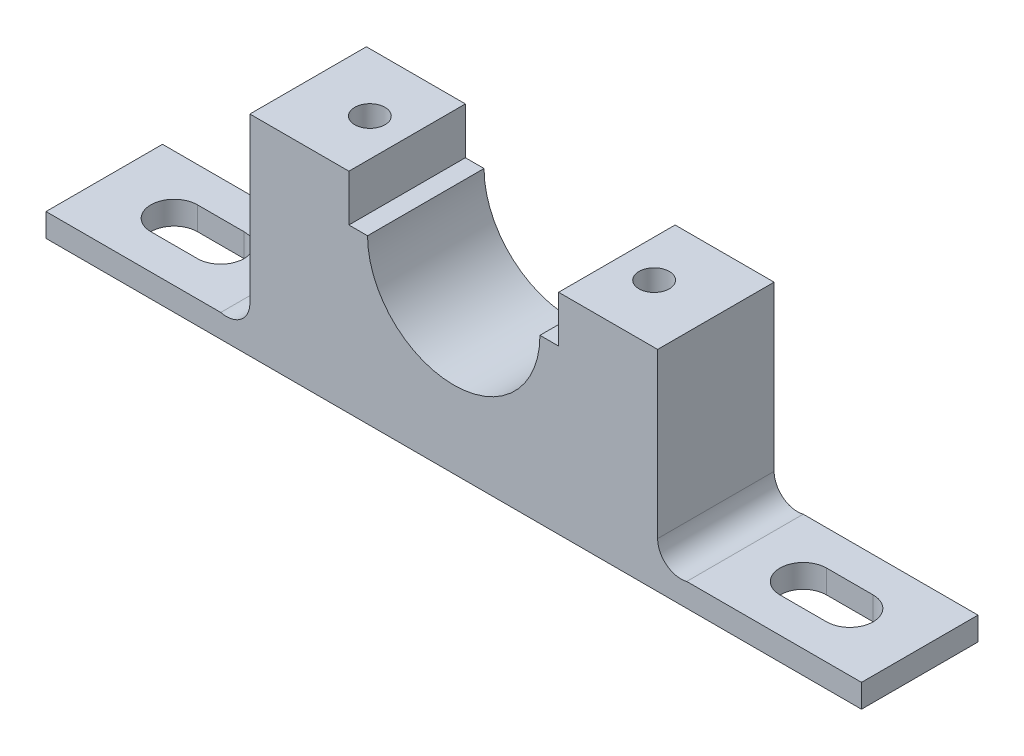
ISO-10303-21;
HEADER;
FILE_DESCRIPTION(('STEP AP214'),'2;1');
FILE_NAME('part.step','',(''),(''),'','','');
FILE_SCHEMA(('AUTOMOTIVE_DESIGN { 1 0 10303 214 1 1 1 1 }'));
ENDSEC;
DATA;
#1=APPLICATION_CONTEXT('core data for automotive mechanical design processes');
#2=APPLICATION_PROTOCOL_DEFINITION('international standard','automotive_design',2000,#1);
#3=PRODUCT_CONTEXT('',#1,'mechanical');
#4=PRODUCT('Part','Part','',(#3));
#5=PRODUCT_RELATED_PRODUCT_CATEGORY('part','',(#4));
#6=PRODUCT_DEFINITION_FORMATION('','',#4);
#7=PRODUCT_DEFINITION_CONTEXT('part definition',#1,'design');
#8=PRODUCT_DEFINITION('design','',#6,#7);
#9=PRODUCT_DEFINITION_SHAPE('','',#8);
#10=(LENGTH_UNIT() NAMED_UNIT(*) SI_UNIT(.MILLI.,.METRE.));
#11=(NAMED_UNIT(*) PLANE_ANGLE_UNIT() SI_UNIT($,.RADIAN.));
#12=(NAMED_UNIT(*) SI_UNIT($,.STERADIAN.) SOLID_ANGLE_UNIT());
#13=UNCERTAINTY_MEASURE_WITH_UNIT(LENGTH_MEASURE(1.E-05),#10,'distance_accuracy_value','');
#14=(GEOMETRIC_REPRESENTATION_CONTEXT(3) GLOBAL_UNCERTAINTY_ASSIGNED_CONTEXT((#13)) GLOBAL_UNIT_ASSIGNED_CONTEXT((#10,
#11,#12)) REPRESENTATION_CONTEXT('',''));
#15=CARTESIAN_POINT('',(0.,0.,0.));
#16=DIRECTION('',(0.,0.,1.));
#17=DIRECTION('',(1.,0.,0.));
#18=AXIS2_PLACEMENT_3D('',#15,#16,#17);
#19=CARTESIAN_POINT('',(87.5,0.,-12.5));
#20=DIRECTION('',(0.,1.,0.));
#21=DIRECTION('',(0.,0.,1.));
#22=AXIS2_PLACEMENT_3D('',#19,#20,#21);
#23=PLANE('',#22);
#24=DIRECTION('',(-1.,0.,0.));
#25=VECTOR('',#24,1.);
#26=CARTESIAN_POINT('',(72.5026506643701,0.,5.00000000000003));
#27=LINE('',#26,#25);
#28=CARTESIAN_POINT('',(72.5026506643701,0.,5.00000000000003));
#29=VERTEX_POINT('',#28);
#30=CARTESIAN_POINT('',(62.5026506643701,0.,5.00000000000003));
#31=VERTEX_POINT('',#30);
#32=EDGE_CURVE('E256',#29,#31,#27,.T.);
#33=ORIENTED_EDGE('',*,*,#32,.F.);
#34=CARTESIAN_POINT('',(72.5026506643701,0.,0.));
#35=DIRECTION('',(0.,-1.,0.));
#36=DIRECTION('',(0.,0.,-1.));
#37=AXIS2_PLACEMENT_3D('',#34,#35,#36);
#38=CIRCLE('',#37,5.);
#39=CARTESIAN_POINT('',(72.5026506643701,0.,-4.99999999999997));
#40=VERTEX_POINT('',#39);
#41=EDGE_CURVE('E63',#40,#29,#38,.T.);
#42=ORIENTED_EDGE('',*,*,#41,.F.);
#43=DIRECTION('',(-1.,0.,0.));
#44=VECTOR('',#43,1.);
#45=CARTESIAN_POINT('',(72.5026506643701,0.,-4.99999999999997));
#46=LINE('',#45,#44);
#47=CARTESIAN_POINT('',(62.5026506643701,0.,-4.99999999999997));
#48=VERTEX_POINT('',#47);
#49=EDGE_CURVE('E240',#40,#48,#46,.T.);
#50=ORIENTED_EDGE('',*,*,#49,.T.);
#51=CARTESIAN_POINT('',(62.5026506643701,0.,0.));
#52=DIRECTION('',(0.,1.,0.));
#53=DIRECTION('',(0.,0.,1.));
#54=AXIS2_PLACEMENT_3D('',#51,#52,#53);
#55=CIRCLE('',#54,5.);
#56=EDGE_CURVE('E252',#48,#31,#55,.T.);
#57=ORIENTED_EDGE('',*,*,#56,.T.);
#58=EDGE_LOOP('',(#33,#42,#50,#57));
#59=FACE_BOUND('',#58,.T.);
#60=CARTESIAN_POINT('',(-30.5,0.,0.));
#61=DIRECTION('',(0.,1.,0.));
#62=DIRECTION('',(0.,0.,1.));
#63=AXIS2_PLACEMENT_3D('',#60,#61,#62);
#64=CIRCLE('',#63,3.25);
#65=CARTESIAN_POINT('',(-30.5,0.,-3.24999999999998));
#66=VERTEX_POINT('',#65);
#67=EDGE_CURVE('E271',#66,#66,#64,.T.);
#68=ORIENTED_EDGE('',*,*,#67,.T.);
#69=EDGE_LOOP('',(#68));
#70=FACE_BOUND('',#69,.T.);
#71=DIRECTION('',(0.,0.,1.));
#72=VECTOR('',#71,1.);
#73=CARTESIAN_POINT('',(87.5,0.,-12.5));
#74=LINE('',#73,#72);
#75=CARTESIAN_POINT('',(87.5,0.,-12.5));
#76=VERTEX_POINT('',#75);
#77=CARTESIAN_POINT('',(87.5,0.,12.5));
#78=VERTEX_POINT('',#77);
#79=EDGE_CURVE('E426',#76,#78,#74,.T.);
#80=ORIENTED_EDGE('',*,*,#79,.T.);
#81=DIRECTION('',(-1.,0.,0.));
#82=VECTOR('',#81,1.);
#83=CARTESIAN_POINT('',(87.5,0.,12.5));
#84=LINE('',#83,#82);
#85=CARTESIAN_POINT('',(-87.5,0.,12.5));
#86=VERTEX_POINT('',#85);
#87=EDGE_CURVE('E321',#78,#86,#84,.T.);
#88=ORIENTED_EDGE('',*,*,#87,.T.);
#89=DIRECTION('',(0.,0.,1.));
#90=VECTOR('',#89,1.);
#91=CARTESIAN_POINT('',(-87.5,0.,-12.5));
#92=LINE('',#91,#90);
#93=CARTESIAN_POINT('',(-87.5,0.,-12.5));
#94=VERTEX_POINT('',#93);
#95=EDGE_CURVE('E423',#94,#86,#92,.T.);
#96=ORIENTED_EDGE('',*,*,#95,.F.);
#97=DIRECTION('',(-1.,0.,0.));
#98=VECTOR('',#97,1.);
#99=CARTESIAN_POINT('',(87.5,0.,-12.5));
#100=LINE('',#99,#98);
#101=EDGE_CURVE('E381',#76,#94,#100,.T.);
#102=ORIENTED_EDGE('',*,*,#101,.F.);
#103=EDGE_LOOP('',(#80,#88,#96,#102));
#104=FACE_BOUND('',#103,.T.);
#105=CARTESIAN_POINT('',(30.5,0.,0.));
#106=DIRECTION('',(0.,-1.,0.));
#107=DIRECTION('',(0.,0.,-1.));
#108=AXIS2_PLACEMENT_3D('',#105,#106,#107);
#109=CIRCLE('',#108,3.25);
#110=CARTESIAN_POINT('',(30.5,0.,-3.24999999999998));
#111=VERTEX_POINT('',#110);
#112=EDGE_CURVE('E267',#111,#111,#109,.T.);
#113=ORIENTED_EDGE('',*,*,#112,.F.);
#114=EDGE_LOOP('',(#113));
#115=FACE_BOUND('',#114,.T.);
#116=CARTESIAN_POINT('',(-72.5026506643701,0.,0.));
#117=DIRECTION('',(0.,1.,0.));
#118=DIRECTION('',(0.,0.,1.));
#119=AXIS2_PLACEMENT_3D('',#116,#117,#118);
#120=CIRCLE('',#119,5.);
#121=CARTESIAN_POINT('',(-72.5026506643701,0.,-4.99999999999997));
#122=VERTEX_POINT('',#121);
#123=CARTESIAN_POINT('',(-72.5026506643701,0.,5.00000000000003));
#124=VERTEX_POINT('',#123);
#125=EDGE_CURVE('E230',#122,#124,#120,.T.);
#126=ORIENTED_EDGE('',*,*,#125,.T.);
#127=DIRECTION('',(1.,0.,0.));
#128=VECTOR('',#127,1.);
#129=CARTESIAN_POINT('',(-72.5026506643701,0.,5.00000000000003));
#130=LINE('',#129,#128);
#131=CARTESIAN_POINT('',(-62.5026506643701,0.,5.00000000000003));
#132=VERTEX_POINT('',#131);
#133=EDGE_CURVE('E226',#124,#132,#130,.T.);
#134=ORIENTED_EDGE('',*,*,#133,.T.);
#135=CARTESIAN_POINT('',(-62.5026506643701,0.,0.));
#136=DIRECTION('',(0.,-1.,0.));
#137=DIRECTION('',(0.,0.,-1.));
#138=AXIS2_PLACEMENT_3D('',#135,#136,#137);
#139=CIRCLE('',#138,5.);
#140=CARTESIAN_POINT('',(-62.5026506643701,0.,-4.99999999999997));
#141=VERTEX_POINT('',#140);
#142=EDGE_CURVE('E206',#141,#132,#139,.T.);
#143=ORIENTED_EDGE('',*,*,#142,.F.);
#144=DIRECTION('',(1.,0.,0.));
#145=VECTOR('',#144,1.);
#146=CARTESIAN_POINT('',(-72.5026506643701,0.,-4.99999999999997));
#147=LINE('',#146,#145);
#148=EDGE_CURVE('E218',#122,#141,#147,.T.);
#149=ORIENTED_EDGE('',*,*,#148,.F.);
#150=EDGE_LOOP('',(#126,#134,#143,#149));
#151=FACE_BOUND('',#150,.T.);
#152=ADVANCED_FACE('F39',(#59,#70,#104,#115,#151),#23,.F.);
#153=CARTESIAN_POINT('',(-87.5,4.99999999999999,-12.5));
#154=DIRECTION('',(0.,-1.,0.));
#155=DIRECTION('',(0.,0.,-1.));
#156=AXIS2_PLACEMENT_3D('',#153,#154,#155);
#157=PLANE('',#156);
#158=DIRECTION('',(0.,0.,1.));
#159=VECTOR('',#158,1.);
#160=CARTESIAN_POINT('',(-87.5,4.99999999999999,-12.5));
#161=LINE('',#160,#159);
#162=CARTESIAN_POINT('',(-87.5,4.99999999999999,-12.5));
#163=VERTEX_POINT('',#162);
#164=CARTESIAN_POINT('',(-87.5,4.99999999999999,12.5));
#165=VERTEX_POINT('',#164);
#166=EDGE_CURVE('E420',#163,#165,#161,.T.);
#167=ORIENTED_EDGE('',*,*,#166,.T.);
#168=DIRECTION('',(1.,0.,0.));
#169=VECTOR('',#168,1.);
#170=CARTESIAN_POINT('',(-87.5,4.99999999999999,12.5));
#171=LINE('',#170,#169);
#172=CARTESIAN_POINT('',(-49.9965747482538,4.99999999999999,12.5));
#173=VERTEX_POINT('',#172);
#174=EDGE_CURVE('E329',#165,#173,#171,.T.);
#175=ORIENTED_EDGE('',*,*,#174,.T.);
#176=DIRECTION('',(0.,0.,1.));
#177=VECTOR('',#176,1.);
#178=CARTESIAN_POINT('',(-49.9965747482538,4.99999999999999,-12.5));
#179=LINE('',#178,#177);
#180=CARTESIAN_POINT('',(-49.9965747482538,4.99999999999999,-12.5));
#181=VERTEX_POINT('',#180);
#182=EDGE_CURVE('E417',#181,#173,#179,.T.);
#183=ORIENTED_EDGE('',*,*,#182,.F.);
#184=DIRECTION('',(1.,0.,0.));
#185=VECTOR('',#184,1.);
#186=CARTESIAN_POINT('',(-87.5,4.99999999999999,-12.5));
#187=LINE('',#186,#185);
#188=EDGE_CURVE('E387',#163,#181,#187,.T.);
#189=ORIENTED_EDGE('',*,*,#188,.F.);
#190=EDGE_LOOP('',(#167,#175,#183,#189));
#191=FACE_BOUND('',#190,.T.);
#192=CARTESIAN_POINT('',(-72.5026506643701,5.,0.));
#193=DIRECTION('',(0.,-1.,0.));
#194=DIRECTION('',(0.,0.,-1.));
#195=AXIS2_PLACEMENT_3D('',#192,#193,#194);
#196=CIRCLE('',#195,5.);
#197=CARTESIAN_POINT('',(-72.5026506643701,5.,-4.99999999999997));
#198=VERTEX_POINT('',#197);
#199=CARTESIAN_POINT('',(-72.5026506643701,5.,5.00000000000003));
#200=VERTEX_POINT('',#199);
#201=EDGE_CURVE('E11',#198,#200,#196,.F.);
#202=ORIENTED_EDGE('',*,*,#201,.F.);
#203=DIRECTION('',(1.,0.,0.));
#204=VECTOR('',#203,1.);
#205=CARTESIAN_POINT('',(-87.5,4.99999999999999,-4.99999999999997));
#206=LINE('',#205,#204);
#207=CARTESIAN_POINT('',(-62.5026506643701,4.99999999999999,-4.99999999999997));
#208=VERTEX_POINT('',#207);
#209=EDGE_CURVE('E453',#198,#208,#206,.T.);
#210=ORIENTED_EDGE('',*,*,#209,.T.);
#211=CARTESIAN_POINT('',(-62.5026506643701,5.,0.));
#212=DIRECTION('',(0.,-1.,0.));
#213=DIRECTION('',(0.,0.,-1.));
#214=AXIS2_PLACEMENT_3D('',#211,#212,#213);
#215=CIRCLE('',#214,5.);
#216=CARTESIAN_POINT('',(-62.5026506643701,5.00000000000001,5.00000000000003));
#217=VERTEX_POINT('',#216);
#218=EDGE_CURVE('E209',#208,#217,#215,.T.);
#219=ORIENTED_EDGE('',*,*,#218,.T.);
#220=DIRECTION('',(1.,0.,0.));
#221=VECTOR('',#220,1.);
#222=CARTESIAN_POINT('',(-87.5,4.99999999999999,5.00000000000002));
#223=LINE('',#222,#221);
#224=EDGE_CURVE('E48',#200,#217,#223,.T.);
#225=ORIENTED_EDGE('',*,*,#224,.F.);
#226=EDGE_LOOP('',(#202,#210,#219,#225));
#227=FACE_BOUND('',#226,.T.);
#228=ADVANCED_FACE('F466',(#191,#227),#157,.F.);
#229=CARTESIAN_POINT('',(-22.5,35.,-12.5));
#230=DIRECTION('',(0.,-1.,0.));
#231=DIRECTION('',(0.,0.,-1.));
#232=AXIS2_PLACEMENT_3D('',#229,#230,#231);
#233=PLANE('',#232);
#234=DIRECTION('',(0.,0.,1.));
#235=VECTOR('',#234,1.);
#236=CARTESIAN_POINT('',(-22.5,35.,-12.5));
#237=LINE('',#236,#235);
#238=CARTESIAN_POINT('',(-22.5,35.,-12.5));
#239=VERTEX_POINT('',#238);
#240=CARTESIAN_POINT('',(-22.5,35.,12.5));
#241=VERTEX_POINT('',#240);
#242=EDGE_CURVE('E405',#239,#241,#237,.T.);
#243=ORIENTED_EDGE('',*,*,#242,.T.);
#244=DIRECTION('',(1.,0.,0.));
#245=VECTOR('',#244,1.);
#246=CARTESIAN_POINT('',(-22.5,35.,12.5));
#247=LINE('',#246,#245);
#248=CARTESIAN_POINT('',(-18.5,35.,12.5));
#249=VERTEX_POINT('',#248);
#250=EDGE_CURVE('E285',#241,#249,#247,.T.);
#251=ORIENTED_EDGE('',*,*,#250,.T.);
#252=DIRECTION('',(0.,0.,1.));
#253=VECTOR('',#252,1.);
#254=CARTESIAN_POINT('',(-18.5,35.,-12.5));
#255=LINE('',#254,#253);
#256=CARTESIAN_POINT('',(-18.5,35.,-12.5));
#257=VERTEX_POINT('',#256);
#258=EDGE_CURVE('E450',#257,#249,#255,.T.);
#259=ORIENTED_EDGE('',*,*,#258,.F.);
#260=DIRECTION('',(1.,0.,0.));
#261=VECTOR('',#260,1.);
#262=CARTESIAN_POINT('',(-22.5,35.,-12.5));
#263=LINE('',#262,#261);
#264=EDGE_CURVE('E349',#239,#257,#263,.T.);
#265=ORIENTED_EDGE('',*,*,#264,.F.);
#266=EDGE_LOOP('',(#243,#251,#259,#265));
#267=FACE_BOUND('',#266,.T.);
#268=ADVANCED_FACE('F41',(#267),#233,.F.);
#269=CARTESIAN_POINT('',(0.,35.,-12.5));
#270=DIRECTION('',(0.,0.,1.));
#271=DIRECTION('',(1.,0.,0.));
#272=AXIS2_PLACEMENT_3D('',#269,#270,#271);
#273=CYLINDRICAL_SURFACE('',#272,18.5);
#274=ORIENTED_EDGE('',*,*,#258,.T.);
#275=CARTESIAN_POINT('',(0.,35.,12.5));
#276=DIRECTION('',(0.,0.,1.));
#277=DIRECTION('',(1.,0.,0.));
#278=AXIS2_PLACEMENT_3D('',#275,#276,#277);
#279=CIRCLE('',#278,18.5);
#280=CARTESIAN_POINT('',(18.5,35.,12.5));
#281=VERTEX_POINT('',#280);
#282=EDGE_CURVE('E289',#249,#281,#279,.T.);
#283=ORIENTED_EDGE('',*,*,#282,.T.);
#284=DIRECTION('',(0.,0.,1.));
#285=VECTOR('',#284,1.);
#286=CARTESIAN_POINT('',(18.5,35.,-12.5));
#287=LINE('',#286,#285);
#288=CARTESIAN_POINT('',(18.5,35.,-12.5));
#289=VERTEX_POINT('',#288);
#290=EDGE_CURVE('E447',#289,#281,#287,.T.);
#291=ORIENTED_EDGE('',*,*,#290,.F.);
#292=CARTESIAN_POINT('',(0.,35.,-12.5));
#293=DIRECTION('',(0.,0.,1.));
#294=DIRECTION('',(1.,0.,0.));
#295=AXIS2_PLACEMENT_3D('',#292,#293,#294);
#296=CIRCLE('',#295,18.5);
#297=EDGE_CURVE('E353',#257,#289,#296,.T.);
#298=ORIENTED_EDGE('',*,*,#297,.F.);
#299=EDGE_LOOP('',(#274,#283,#291,#298));
#300=FACE_BOUND('',#299,.T.);
#301=ADVANCED_FACE('F533',(#300),#273,.F.);
#302=CARTESIAN_POINT('',(22.5,35.,-12.5));
#303=DIRECTION('',(0.,1.,0.));
#304=DIRECTION('',(0.,0.,1.));
#305=AXIS2_PLACEMENT_3D('',#302,#303,#304);
#306=PLANE('',#305);
#307=ORIENTED_EDGE('',*,*,#290,.T.);
#308=DIRECTION('',(-1.,0.,0.));
#309=VECTOR('',#308,1.);
#310=CARTESIAN_POINT('',(22.5,35.,12.5));
#311=LINE('',#310,#309);
#312=CARTESIAN_POINT('',(22.5,35.,12.5));
#313=VERTEX_POINT('',#312);
#314=EDGE_CURVE('E293',#313,#281,#311,.T.);
#315=ORIENTED_EDGE('',*,*,#314,.F.);
#316=DIRECTION('',(0.,0.,1.));
#317=VECTOR('',#316,1.);
#318=CARTESIAN_POINT('',(22.5,35.,-12.5));
#319=LINE('',#318,#317);
#320=CARTESIAN_POINT('',(22.5,35.,-12.5));
#321=VERTEX_POINT('',#320);
#322=EDGE_CURVE('E444',#321,#313,#319,.T.);
#323=ORIENTED_EDGE('',*,*,#322,.F.);
#324=DIRECTION('',(-1.,0.,0.));
#325=VECTOR('',#324,1.);
#326=CARTESIAN_POINT('',(22.5,35.,-12.5));
#327=LINE('',#326,#325);
#328=EDGE_CURVE('E356',#321,#289,#327,.T.);
#329=ORIENTED_EDGE('',*,*,#328,.T.);
#330=EDGE_LOOP('',(#307,#315,#323,#329));
#331=FACE_BOUND('',#330,.T.);
#332=ADVANCED_FACE('F530',(#331),#306,.T.);
#333=CARTESIAN_POINT('',(22.5,45.,-12.5));
#334=DIRECTION('',(-1.,0.,0.));
#335=DIRECTION('',(0.,-1.,0.));
#336=AXIS2_PLACEMENT_3D('',#333,#334,#335);
#337=PLANE('',#336);
#338=ORIENTED_EDGE('',*,*,#322,.T.);
#339=DIRECTION('',(0.,-1.,0.));
#340=VECTOR('',#339,1.);
#341=CARTESIAN_POINT('',(22.5,45.,12.5));
#342=LINE('',#341,#340);
#343=CARTESIAN_POINT('',(22.5,45.,12.5));
#344=VERTEX_POINT('',#343);
#345=EDGE_CURVE('E297',#344,#313,#342,.T.);
#346=ORIENTED_EDGE('',*,*,#345,.F.);
#347=DIRECTION('',(0.,0.,1.));
#348=VECTOR('',#347,1.);
#349=CARTESIAN_POINT('',(22.5,45.,-12.5));
#350=LINE('',#349,#348);
#351=CARTESIAN_POINT('',(22.5,45.,-12.5));
#352=VERTEX_POINT('',#351);
#353=EDGE_CURVE('E441',#352,#344,#350,.T.);
#354=ORIENTED_EDGE('',*,*,#353,.F.);
#355=DIRECTION('',(0.,-1.,0.));
#356=VECTOR('',#355,1.);
#357=CARTESIAN_POINT('',(22.5,45.,-12.5));
#358=LINE('',#357,#356);
#359=EDGE_CURVE('E360',#352,#321,#358,.T.);
#360=ORIENTED_EDGE('',*,*,#359,.T.);
#361=EDGE_LOOP('',(#338,#346,#354,#360));
#362=FACE_BOUND('',#361,.T.);
#363=ADVANCED_FACE('F526',(#362),#337,.T.);
#364=CARTESIAN_POINT('',(22.5,45.,-12.5));
#365=DIRECTION('',(0.,-1.,0.));
#366=DIRECTION('',(0.,0.,-1.));
#367=AXIS2_PLACEMENT_3D('',#364,#365,#366);
#368=PLANE('',#367);
#369=CARTESIAN_POINT('',(30.5,45.,0.));
#370=DIRECTION('',(0.,-1.,0.));
#371=DIRECTION('',(0.,0.,-1.));
#372=AXIS2_PLACEMENT_3D('',#369,#370,#371);
#373=CIRCLE('',#372,3.25);
#374=CARTESIAN_POINT('',(30.5,45.,-3.24999999999998));
#375=VERTEX_POINT('',#374);
#376=EDGE_CURVE('E262',#375,#375,#373,.T.);
#377=ORIENTED_EDGE('',*,*,#376,.T.);
#378=EDGE_LOOP('',(#377));
#379=FACE_BOUND('',#378,.T.);
#380=ORIENTED_EDGE('',*,*,#353,.T.);
#381=DIRECTION('',(1.,0.,0.));
#382=VECTOR('',#381,1.);
#383=CARTESIAN_POINT('',(22.5,45.,12.5));
#384=LINE('',#383,#382);
#385=CARTESIAN_POINT('',(43.75,45.,12.5));
#386=VERTEX_POINT('',#385);
#387=EDGE_CURVE('E301',#344,#386,#384,.T.);
#388=ORIENTED_EDGE('',*,*,#387,.T.);
#389=DIRECTION('',(0.,0.,1.));
#390=VECTOR('',#389,1.);
#391=CARTESIAN_POINT('',(43.75,45.,-12.5));
#392=LINE('',#391,#390);
#393=CARTESIAN_POINT('',(43.75,45.,-12.5));
#394=VERTEX_POINT('',#393);
#395=EDGE_CURVE('E438',#394,#386,#392,.T.);
#396=ORIENTED_EDGE('',*,*,#395,.F.);
#397=DIRECTION('',(1.,0.,0.));
#398=VECTOR('',#397,1.);
#399=CARTESIAN_POINT('',(22.5,45.,-12.5));
#400=LINE('',#399,#398);
#401=EDGE_CURVE('E364',#352,#394,#400,.T.);
#402=ORIENTED_EDGE('',*,*,#401,.F.);
#403=EDGE_LOOP('',(#380,#388,#396,#402));
#404=FACE_BOUND('',#403,.T.);
#405=ADVANCED_FACE('F522',(#379,#404),#368,.F.);
#406=CARTESIAN_POINT('',(43.75,45.,-12.5));
#407=DIRECTION('',(-1.,0.,0.));
#408=DIRECTION('',(0.,-1.,0.));
#409=AXIS2_PLACEMENT_3D('',#406,#407,#408);
#410=PLANE('',#409);
#411=ORIENTED_EDGE('',*,*,#395,.T.);
#412=DIRECTION('',(0.,-1.,0.));
#413=VECTOR('',#412,1.);
#414=CARTESIAN_POINT('',(43.75,45.,12.5));
#415=LINE('',#414,#413);
#416=CARTESIAN_POINT('',(43.75,9.84211228670047,12.5));
#417=VERTEX_POINT('',#416);
#418=EDGE_CURVE('E305',#386,#417,#415,.T.);
#419=ORIENTED_EDGE('',*,*,#418,.T.);
#420=DIRECTION('',(0.,0.,1.));
#421=VECTOR('',#420,1.);
#422=CARTESIAN_POINT('',(43.75,9.84211228670047,-12.5));
#423=LINE('',#422,#421);
#424=CARTESIAN_POINT('',(43.75,9.84211228670047,-12.5));
#425=VERTEX_POINT('',#424);
#426=EDGE_CURVE('E435',#425,#417,#423,.T.);
#427=ORIENTED_EDGE('',*,*,#426,.F.);
#428=DIRECTION('',(0.,-1.,0.));
#429=VECTOR('',#428,1.);
#430=CARTESIAN_POINT('',(43.75,45.,-12.5));
#431=LINE('',#430,#429);
#432=EDGE_CURVE('E367',#394,#425,#431,.T.);
#433=ORIENTED_EDGE('',*,*,#432,.F.);
#434=EDGE_LOOP('',(#411,#419,#427,#433));
#435=FACE_BOUND('',#434,.T.);
#436=ADVANCED_FACE('F518',(#435),#410,.F.);
#437=CARTESIAN_POINT('',(48.75,9.84211228670047,-12.5));
#438=DIRECTION('',(0.,0.,1.));
#439=DIRECTION('',(1.,0.,0.));
#440=AXIS2_PLACEMENT_3D('',#437,#438,#439);
#441=CYLINDRICAL_SURFACE('',#440,5.);
#442=ORIENTED_EDGE('',*,*,#426,.T.);
#443=CARTESIAN_POINT('',(48.75,9.84211228670047,12.5));
#444=DIRECTION('',(0.,0.,1.));
#445=DIRECTION('',(1.,0.,0.));
#446=AXIS2_PLACEMENT_3D('',#443,#444,#445);
#447=CIRCLE('',#446,5.);
#448=CARTESIAN_POINT('',(49.9965747482538,4.99999999999999,12.5));
#449=VERTEX_POINT('',#448);
#450=EDGE_CURVE('E309',#417,#449,#447,.T.);
#451=ORIENTED_EDGE('',*,*,#450,.T.);
#452=DIRECTION('',(0.,0.,1.));
#453=VECTOR('',#452,1.);
#454=CARTESIAN_POINT('',(49.9965747482538,4.99999999999999,-12.5));
#455=LINE('',#454,#453);
#456=CARTESIAN_POINT('',(49.9965747482538,4.99999999999999,-12.5));
#457=VERTEX_POINT('',#456);
#458=EDGE_CURVE('E432',#457,#449,#455,.T.);
#459=ORIENTED_EDGE('',*,*,#458,.F.);
#460=CARTESIAN_POINT('',(48.75,9.84211228670047,-12.5));
#461=DIRECTION('',(0.,0.,1.));
#462=DIRECTION('',(1.,0.,0.));
#463=AXIS2_PLACEMENT_3D('',#460,#461,#462);
#464=CIRCLE('',#463,5.);
#465=EDGE_CURVE('E370',#425,#457,#464,.T.);
#466=ORIENTED_EDGE('',*,*,#465,.F.);
#467=EDGE_LOOP('',(#442,#451,#459,#466));
#468=FACE_BOUND('',#467,.T.);
#469=ADVANCED_FACE('F514',(#468),#441,.F.);
#470=CARTESIAN_POINT('',(87.5,4.99999999999999,-12.5));
#471=DIRECTION('',(0.,1.,0.));
#472=DIRECTION('',(0.,0.,1.));
#473=AXIS2_PLACEMENT_3D('',#470,#471,#472);
#474=PLANE('',#473);
#475=CARTESIAN_POINT('',(72.5026506643701,4.99999999999999,0.));
#476=DIRECTION('',(0.,1.,0.));
#477=DIRECTION('',(0.,0.,1.));
#478=AXIS2_PLACEMENT_3D('',#475,#476,#477);
#479=CIRCLE('',#478,5.);
#480=CARTESIAN_POINT('',(72.5026506643701,5.,5.00000000000003));
#481=VERTEX_POINT('',#480);
#482=CARTESIAN_POINT('',(72.5026506643701,5.,-4.99999999999997));
#483=VERTEX_POINT('',#482);
#484=EDGE_CURVE('E282',#481,#483,#479,.T.);
#485=ORIENTED_EDGE('',*,*,#484,.F.);
#486=DIRECTION('',(1.,0.,0.));
#487=VECTOR('',#486,1.);
#488=CARTESIAN_POINT('',(87.5,4.99999999999999,5.00000000000002));
#489=LINE('',#488,#487);
#490=CARTESIAN_POINT('',(62.5026506643701,4.99999999999999,5.00000000000002));
#491=VERTEX_POINT('',#490);
#492=EDGE_CURVE('E266',#491,#481,#489,.T.);
#493=ORIENTED_EDGE('',*,*,#492,.F.);
#494=CARTESIAN_POINT('',(62.5026506643701,4.99999999999999,0.));
#495=DIRECTION('',(0.,1.,0.));
#496=DIRECTION('',(0.,0.,1.));
#497=AXIS2_PLACEMENT_3D('',#494,#495,#496);
#498=CIRCLE('',#497,5.);
#499=CARTESIAN_POINT('',(62.5026506643701,5.,-4.99999999999997));
#500=VERTEX_POINT('',#499);
#501=EDGE_CURVE('E274',#491,#500,#498,.F.);
#502=ORIENTED_EDGE('',*,*,#501,.T.);
#503=DIRECTION('',(1.,0.,0.));
#504=VECTOR('',#503,1.);
#505=CARTESIAN_POINT('',(87.5,4.99999999999999,-4.99999999999997));
#506=LINE('',#505,#504);
#507=EDGE_CURVE('E278',#500,#483,#506,.T.);
#508=ORIENTED_EDGE('',*,*,#507,.T.);
#509=EDGE_LOOP('',(#485,#493,#502,#508));
#510=FACE_BOUND('',#509,.T.);
#511=ORIENTED_EDGE('',*,*,#458,.T.);
#512=DIRECTION('',(-1.,0.,0.));
#513=VECTOR('',#512,1.);
#514=CARTESIAN_POINT('',(87.5,4.99999999999999,12.5));
#515=LINE('',#514,#513);
#516=CARTESIAN_POINT('',(87.5,4.99999999999999,12.5));
#517=VERTEX_POINT('',#516);
#518=EDGE_CURVE('E313',#517,#449,#515,.T.);
#519=ORIENTED_EDGE('',*,*,#518,.F.);
#520=DIRECTION('',(0.,0.,1.));
#521=VECTOR('',#520,1.);
#522=CARTESIAN_POINT('',(87.5,4.99999999999999,-12.5));
#523=LINE('',#522,#521);
#524=CARTESIAN_POINT('',(87.5,4.99999999999999,-12.5));
#525=VERTEX_POINT('',#524);
#526=EDGE_CURVE('E429',#525,#517,#523,.T.);
#527=ORIENTED_EDGE('',*,*,#526,.F.);
#528=DIRECTION('',(-1.,0.,0.));
#529=VECTOR('',#528,1.);
#530=CARTESIAN_POINT('',(87.5,4.99999999999999,-12.5));
#531=LINE('',#530,#529);
#532=EDGE_CURVE('E373',#525,#457,#531,.T.);
#533=ORIENTED_EDGE('',*,*,#532,.T.);
#534=EDGE_LOOP('',(#511,#519,#527,#533));
#535=FACE_BOUND('',#534,.T.);
#536=ADVANCED_FACE('F510',(#510,#535),#474,.T.);
#537=CARTESIAN_POINT('',(87.5,0.,-12.5));
#538=DIRECTION('',(1.,0.,0.));
#539=DIRECTION('',(0.,0.,-1.));
#540=AXIS2_PLACEMENT_3D('',#537,#538,#539);
#541=PLANE('',#540);
#542=ORIENTED_EDGE('',*,*,#526,.T.);
#543=DIRECTION('',(0.,1.,0.));
#544=VECTOR('',#543,1.);
#545=CARTESIAN_POINT('',(87.5,0.,12.5));
#546=LINE('',#545,#544);
#547=EDGE_CURVE('E317',#78,#517,#546,.T.);
#548=ORIENTED_EDGE('',*,*,#547,.F.);
#549=ORIENTED_EDGE('',*,*,#79,.F.);
#550=DIRECTION('',(0.,1.,0.));
#551=VECTOR('',#550,1.);
#552=CARTESIAN_POINT('',(87.5,0.,-12.5));
#553=LINE('',#552,#551);
#554=EDGE_CURVE('E377',#76,#525,#553,.T.);
#555=ORIENTED_EDGE('',*,*,#554,.T.);
#556=EDGE_LOOP('',(#542,#548,#549,#555));
#557=FACE_BOUND('',#556,.T.);
#558=ADVANCED_FACE('F507',(#557),#541,.T.);
#559=CARTESIAN_POINT('',(-87.5,0.,-12.5));
#560=DIRECTION('',(1.,0.,0.));
#561=DIRECTION('',(0.,0.,-1.));
#562=AXIS2_PLACEMENT_3D('',#559,#560,#561);
#563=PLANE('',#562);
#564=ORIENTED_EDGE('',*,*,#95,.T.);
#565=DIRECTION('',(0.,1.,0.));
#566=VECTOR('',#565,1.);
#567=CARTESIAN_POINT('',(-87.5,0.,12.5));
#568=LINE('',#567,#566);
#569=EDGE_CURVE('E325',#86,#165,#568,.T.);
#570=ORIENTED_EDGE('',*,*,#569,.T.);
#571=ORIENTED_EDGE('',*,*,#166,.F.);
#572=DIRECTION('',(0.,1.,0.));
#573=VECTOR('',#572,1.);
#574=CARTESIAN_POINT('',(-87.5,0.,-12.5));
#575=LINE('',#574,#573);
#576=EDGE_CURVE('E384',#94,#163,#575,.T.);
#577=ORIENTED_EDGE('',*,*,#576,.F.);
#578=EDGE_LOOP('',(#564,#570,#571,#577));
#579=FACE_BOUND('',#578,.T.);
#580=ADVANCED_FACE('F506',(#579),#563,.F.);
#581=CARTESIAN_POINT('',(-48.75,9.84211228670048,-12.5));
#582=DIRECTION('',(0.,0.,1.));
#583=DIRECTION('',(1.,0.,0.));
#584=AXIS2_PLACEMENT_3D('',#581,#582,#583);
#585=CYLINDRICAL_SURFACE('',#584,5.);
#586=ORIENTED_EDGE('',*,*,#182,.T.);
#587=CARTESIAN_POINT('',(-48.75,9.84211228670048,12.5));
#588=DIRECTION('',(0.,0.,-1.));
#589=DIRECTION('',(-1.,0.,0.));
#590=AXIS2_PLACEMENT_3D('',#587,#588,#589);
#591=CIRCLE('',#590,5.);
#592=CARTESIAN_POINT('',(-43.75,9.84211228670048,12.5));
#593=VERTEX_POINT('',#592);
#594=EDGE_CURVE('E333',#593,#173,#591,.T.);
#595=ORIENTED_EDGE('',*,*,#594,.F.);
#596=DIRECTION('',(0.,0.,1.));
#597=VECTOR('',#596,1.);
#598=CARTESIAN_POINT('',(-43.75,9.84211228670048,-12.5));
#599=LINE('',#598,#597);
#600=CARTESIAN_POINT('',(-43.75,9.84211228670048,-12.5));
#601=VERTEX_POINT('',#600);
#602=EDGE_CURVE('E414',#601,#593,#599,.T.);
#603=ORIENTED_EDGE('',*,*,#602,.F.);
#604=CARTESIAN_POINT('',(-48.75,9.84211228670048,-12.5));
#605=DIRECTION('',(0.,0.,-1.));
#606=DIRECTION('',(-1.,0.,0.));
#607=AXIS2_PLACEMENT_3D('',#604,#605,#606);
#608=CIRCLE('',#607,5.);
#609=EDGE_CURVE('E390',#601,#181,#608,.T.);
#610=ORIENTED_EDGE('',*,*,#609,.T.);
#611=EDGE_LOOP('',(#586,#595,#603,#610));
#612=FACE_BOUND('',#611,.T.);
#613=ADVANCED_FACE('F562',(#612),#585,.F.);
#614=CARTESIAN_POINT('',(-43.75,45.,-12.5));
#615=DIRECTION('',(-1.,0.,0.));
#616=DIRECTION('',(0.,-1.,0.));
#617=AXIS2_PLACEMENT_3D('',#614,#615,#616);
#618=PLANE('',#617);
#619=ORIENTED_EDGE('',*,*,#602,.T.);
#620=DIRECTION('',(0.,-1.,0.));
#621=VECTOR('',#620,1.);
#622=CARTESIAN_POINT('',(-43.75,45.,12.5));
#623=LINE('',#622,#621);
#624=CARTESIAN_POINT('',(-43.75,45.,12.5));
#625=VERTEX_POINT('',#624);
#626=EDGE_CURVE('E337',#625,#593,#623,.T.);
#627=ORIENTED_EDGE('',*,*,#626,.F.);
#628=DIRECTION('',(0.,0.,1.));
#629=VECTOR('',#628,1.);
#630=CARTESIAN_POINT('',(-43.75,45.,-12.5));
#631=LINE('',#630,#629);
#632=CARTESIAN_POINT('',(-43.75,45.,-12.5));
#633=VERTEX_POINT('',#632);
#634=EDGE_CURVE('E411',#633,#625,#631,.T.);
#635=ORIENTED_EDGE('',*,*,#634,.F.);
#636=DIRECTION('',(0.,-1.,0.));
#637=VECTOR('',#636,1.);
#638=CARTESIAN_POINT('',(-43.75,45.,-12.5));
#639=LINE('',#638,#637);
#640=EDGE_CURVE('E394',#633,#601,#639,.T.);
#641=ORIENTED_EDGE('',*,*,#640,.T.);
#642=EDGE_LOOP('',(#619,#627,#635,#641));
#643=FACE_BOUND('',#642,.T.);
#644=ADVANCED_FACE('F558',(#643),#618,.T.);
#645=CARTESIAN_POINT('',(-22.5,45.,-12.5));
#646=DIRECTION('',(0.,1.,0.));
#647=DIRECTION('',(0.,0.,1.));
#648=AXIS2_PLACEMENT_3D('',#645,#646,#647);
#649=PLANE('',#648);
#650=CARTESIAN_POINT('',(-30.5,45.,0.));
#651=DIRECTION('',(0.,1.,0.));
#652=DIRECTION('',(0.,0.,1.));
#653=AXIS2_PLACEMENT_3D('',#650,#651,#652);
#654=CIRCLE('',#653,3.25);
#655=CARTESIAN_POINT('',(-30.5,45.,-3.24999999999998));
#656=VERTEX_POINT('',#655);
#657=EDGE_CURVE('E236',#656,#656,#654,.T.);
#658=ORIENTED_EDGE('',*,*,#657,.F.);
#659=EDGE_LOOP('',(#658));
#660=FACE_BOUND('',#659,.T.);
#661=ORIENTED_EDGE('',*,*,#634,.T.);
#662=DIRECTION('',(-1.,0.,0.));
#663=VECTOR('',#662,1.);
#664=CARTESIAN_POINT('',(-22.5,45.,12.5));
#665=LINE('',#664,#663);
#666=CARTESIAN_POINT('',(-22.5,45.,12.5));
#667=VERTEX_POINT('',#666);
#668=EDGE_CURVE('E341',#667,#625,#665,.T.);
#669=ORIENTED_EDGE('',*,*,#668,.F.);
#670=DIRECTION('',(0.,0.,1.));
#671=VECTOR('',#670,1.);
#672=CARTESIAN_POINT('',(-22.5,45.,-12.5));
#673=LINE('',#672,#671);
#674=CARTESIAN_POINT('',(-22.5,45.,-12.5));
#675=VERTEX_POINT('',#674);
#676=EDGE_CURVE('E408',#675,#667,#673,.T.);
#677=ORIENTED_EDGE('',*,*,#676,.F.);
#678=DIRECTION('',(-1.,0.,0.));
#679=VECTOR('',#678,1.);
#680=CARTESIAN_POINT('',(-22.5,45.,-12.5));
#681=LINE('',#680,#679);
#682=EDGE_CURVE('E398',#675,#633,#681,.T.);
#683=ORIENTED_EDGE('',*,*,#682,.T.);
#684=EDGE_LOOP('',(#661,#669,#677,#683));
#685=FACE_BOUND('',#684,.T.);
#686=ADVANCED_FACE('F593',(#660,#685),#649,.T.);
#687=CARTESIAN_POINT('',(-22.5,45.,-12.5));
#688=DIRECTION('',(-1.,0.,0.));
#689=DIRECTION('',(0.,-1.,0.));
#690=AXIS2_PLACEMENT_3D('',#687,#688,#689);
#691=PLANE('',#690);
#692=ORIENTED_EDGE('',*,*,#676,.T.);
#693=DIRECTION('',(0.,-1.,0.));
#694=VECTOR('',#693,1.);
#695=CARTESIAN_POINT('',(-22.5,45.,12.5));
#696=LINE('',#695,#694);
#697=EDGE_CURVE('E345',#667,#241,#696,.T.);
#698=ORIENTED_EDGE('',*,*,#697,.T.);
#699=ORIENTED_EDGE('',*,*,#242,.F.);
#700=DIRECTION('',(0.,-1.,0.));
#701=VECTOR('',#700,1.);
#702=CARTESIAN_POINT('',(-22.5,45.,-12.5));
#703=LINE('',#702,#701);
#704=EDGE_CURVE('E402',#675,#239,#703,.T.);
#705=ORIENTED_EDGE('',*,*,#704,.F.);
#706=EDGE_LOOP('',(#692,#698,#699,#705));
#707=FACE_BOUND('',#706,.T.);
#708=ADVANCED_FACE('F551',(#707),#691,.F.);
#709=CARTESIAN_POINT('',(0.,35.,-12.5));
#710=DIRECTION('',(0.,0.,1.));
#711=DIRECTION('',(1.,0.,0.));
#712=AXIS2_PLACEMENT_3D('',#709,#710,#711);
#713=PLANE('',#712);
#714=ORIENTED_EDGE('',*,*,#264,.T.);
#715=ORIENTED_EDGE('',*,*,#297,.T.);
#716=ORIENTED_EDGE('',*,*,#328,.F.);
#717=ORIENTED_EDGE('',*,*,#359,.F.);
#718=ORIENTED_EDGE('',*,*,#401,.T.);
#719=ORIENTED_EDGE('',*,*,#432,.T.);
#720=ORIENTED_EDGE('',*,*,#465,.T.);
#721=ORIENTED_EDGE('',*,*,#532,.F.);
#722=ORIENTED_EDGE('',*,*,#554,.F.);
#723=ORIENTED_EDGE('',*,*,#101,.T.);
#724=ORIENTED_EDGE('',*,*,#576,.T.);
#725=ORIENTED_EDGE('',*,*,#188,.T.);
#726=ORIENTED_EDGE('',*,*,#609,.F.);
#727=ORIENTED_EDGE('',*,*,#640,.F.);
#728=ORIENTED_EDGE('',*,*,#682,.F.);
#729=ORIENTED_EDGE('',*,*,#704,.T.);
#730=EDGE_LOOP('',(#714,#715,#716,#717,#718,#719,#720,#721,#722,#723,#724,#725,#726,#727,#728,#729));
#731=FACE_BOUND('',#730,.T.);
#732=ADVANCED_FACE('F492',(#731),#713,.F.);
#733=CARTESIAN_POINT('',(0.,35.,12.5));
#734=DIRECTION('',(0.,0.,1.));
#735=DIRECTION('',(1.,0.,0.));
#736=AXIS2_PLACEMENT_3D('',#733,#734,#735);
#737=PLANE('',#736);
#738=ORIENTED_EDGE('',*,*,#250,.F.);
#739=ORIENTED_EDGE('',*,*,#697,.F.);
#740=ORIENTED_EDGE('',*,*,#668,.T.);
#741=ORIENTED_EDGE('',*,*,#626,.T.);
#742=ORIENTED_EDGE('',*,*,#594,.T.);
#743=ORIENTED_EDGE('',*,*,#174,.F.);
#744=ORIENTED_EDGE('',*,*,#569,.F.);
#745=ORIENTED_EDGE('',*,*,#87,.F.);
#746=ORIENTED_EDGE('',*,*,#547,.T.);
#747=ORIENTED_EDGE('',*,*,#518,.T.);
#748=ORIENTED_EDGE('',*,*,#450,.F.);
#749=ORIENTED_EDGE('',*,*,#418,.F.);
#750=ORIENTED_EDGE('',*,*,#387,.F.);
#751=ORIENTED_EDGE('',*,*,#345,.T.);
#752=ORIENTED_EDGE('',*,*,#314,.T.);
#753=ORIENTED_EDGE('',*,*,#282,.F.);
#754=EDGE_LOOP('',(#738,#739,#740,#741,#742,#743,#744,#745,#746,#747,#748,#749,#750,#751,#752,#753));
#755=FACE_BOUND('',#754,.T.);
#756=ADVANCED_FACE('F484',(#755),#737,.T.);
#757=CARTESIAN_POINT('',(-30.5,45.,0.));
#758=DIRECTION('',(0.,-1.,0.));
#759=DIRECTION('',(0.,0.,-1.));
#760=AXIS2_PLACEMENT_3D('',#757,#758,#759);
#761=CYLINDRICAL_SURFACE('',#760,3.25);
#762=CARTESIAN_POINT('',(-30.5,45.,-3.24999999999998));
#763=CARTESIAN_POINT('',(-30.5,44.53125,-3.24999999999998));
#764=CARTESIAN_POINT('',(-30.5,44.0625,-3.24999999999998));
#765=CARTESIAN_POINT('',(-30.5,43.125,-3.24999999999998));
#766=CARTESIAN_POINT('',(-30.5,42.65625,-3.24999999999998));
#767=CARTESIAN_POINT('',(-30.5,41.71875,-3.24999999999998));
#768=CARTESIAN_POINT('',(-30.5,41.25,-3.24999999999998));
#769=CARTESIAN_POINT('',(-30.5,40.3125,-3.24999999999998));
#770=CARTESIAN_POINT('',(-30.5,39.84375,-3.24999999999998));
#771=CARTESIAN_POINT('',(-30.5,38.90625,-3.24999999999998));
#772=CARTESIAN_POINT('',(-30.5,38.4375,-3.24999999999998));
#773=CARTESIAN_POINT('',(-30.5,37.5,-3.24999999999998));
#774=CARTESIAN_POINT('',(-30.5,37.03125,-3.24999999999998));
#775=CARTESIAN_POINT('',(-30.5,36.09375,-3.24999999999998));
#776=CARTESIAN_POINT('',(-30.5,35.625,-3.24999999999998));
#777=CARTESIAN_POINT('',(-30.5,34.6875,-3.24999999999998));
#778=CARTESIAN_POINT('',(-30.5,34.21875,-3.24999999999998));
#779=CARTESIAN_POINT('',(-30.5,33.28125,-3.24999999999998));
#780=CARTESIAN_POINT('',(-30.5,32.8125,-3.24999999999998));
#781=CARTESIAN_POINT('',(-30.5,31.875,-3.24999999999998));
#782=CARTESIAN_POINT('',(-30.5,31.40625,-3.24999999999998));
#783=CARTESIAN_POINT('',(-30.5,30.46875,-3.24999999999998));
#784=CARTESIAN_POINT('',(-30.5,30.,-3.24999999999998));
#785=CARTESIAN_POINT('',(-30.5,29.0625,-3.24999999999998));
#786=CARTESIAN_POINT('',(-30.5,28.59375,-3.24999999999998));
#787=CARTESIAN_POINT('',(-30.5,27.65625,-3.24999999999998));
#788=CARTESIAN_POINT('',(-30.5,27.1875,-3.24999999999998));
#789=CARTESIAN_POINT('',(-30.5,26.25,-3.24999999999998));
#790=CARTESIAN_POINT('',(-30.5,25.78125,-3.24999999999998));
#791=CARTESIAN_POINT('',(-30.5,24.84375,-3.24999999999998));
#792=CARTESIAN_POINT('',(-30.5,24.375,-3.24999999999998));
#793=CARTESIAN_POINT('',(-30.5,23.4375,-3.24999999999998));
#794=CARTESIAN_POINT('',(-30.5,22.96875,-3.24999999999998));
#795=CARTESIAN_POINT('',(-30.5,22.03125,-3.24999999999998));
#796=CARTESIAN_POINT('',(-30.5,21.5625,-3.24999999999998));
#797=CARTESIAN_POINT('',(-30.5,20.625,-3.24999999999998));
#798=CARTESIAN_POINT('',(-30.5,20.15625,-3.24999999999998));
#799=CARTESIAN_POINT('',(-30.5,19.21875,-3.24999999999998));
#800=CARTESIAN_POINT('',(-30.5,18.75,-3.24999999999998));
#801=CARTESIAN_POINT('',(-30.5,17.8125,-3.24999999999998));
#802=CARTESIAN_POINT('',(-30.5,17.34375,-3.24999999999998));
#803=CARTESIAN_POINT('',(-30.5,16.40625,-3.24999999999998));
#804=CARTESIAN_POINT('',(-30.5,15.9375,-3.24999999999998));
#805=CARTESIAN_POINT('',(-30.5,15.,-3.24999999999998));
#806=CARTESIAN_POINT('',(-30.5,14.53125,-3.24999999999998));
#807=CARTESIAN_POINT('',(-30.5,13.59375,-3.24999999999998));
#808=CARTESIAN_POINT('',(-30.5,13.125,-3.24999999999998));
#809=CARTESIAN_POINT('',(-30.5,12.1875,-3.24999999999998));
#810=CARTESIAN_POINT('',(-30.5,11.71875,-3.24999999999998));
#811=CARTESIAN_POINT('',(-30.5,10.78125,-3.24999999999998));
#812=CARTESIAN_POINT('',(-30.5,10.3125,-3.24999999999998));
#813=CARTESIAN_POINT('',(-30.5,9.375,-3.24999999999998));
#814=CARTESIAN_POINT('',(-30.5,8.90625,-3.24999999999998));
#815=CARTESIAN_POINT('',(-30.5,7.96874999999999,-3.24999999999998));
#816=CARTESIAN_POINT('',(-30.5,7.5,-3.24999999999998));
#817=CARTESIAN_POINT('',(-30.5,6.5625,-3.24999999999998));
#818=CARTESIAN_POINT('',(-30.5,6.09375,-3.24999999999998));
#819=CARTESIAN_POINT('',(-30.5,5.15625,-3.24999999999998));
#820=CARTESIAN_POINT('',(-30.5,4.68749999999999,-3.24999999999998));
#821=CARTESIAN_POINT('',(-30.5,3.74999999999999,-3.24999999999998));
#822=CARTESIAN_POINT('',(-30.5,3.28124999999999,-3.24999999999998));
#823=CARTESIAN_POINT('',(-30.5,2.34374999999999,-3.24999999999998));
#824=CARTESIAN_POINT('',(-30.5,1.87499999999999,-3.24999999999998));
#825=CARTESIAN_POINT('',(-30.5,0.937499999999992,-3.24999999999998));
#826=CARTESIAN_POINT('',(-30.5,0.468749999999993,-3.24999999999998));
#827=CARTESIAN_POINT('',(-30.5,0.,-3.24999999999998));
#828=B_SPLINE_CURVE_WITH_KNOTS('',3,(#762,#763,#764,#765,#766,#767,#768,#769,#770,#771,#772,
#773,#774,#775,#776,#777,#778,#779,#780,#781,#782,#783,#784,#785,#786,#787,#788,#789,#790,#791,
#792,#793,#794,#795,#796,#797,#798,#799,#800,#801,#802,#803,#804,#805,#806,#807,#808,#809,#810,
#811,#812,#813,#814,#815,#816,#817,#818,#819,#820,#821,#822,#823,#824,#825,#826,#827),
.UNSPECIFIED.,.F.,.F.,(4,2,2,2,2,2,2,2,2,2,2,2,2,2,2,2,2,2,2,2,2,2,2,2,2,2,2,2,2,2,2,2,4),(0.,
1.40625,2.8125,4.21875000000001,5.62500000000001,7.03125,8.4375,9.84375000000001,11.25,12.65625,
14.0625,15.46875,16.875,18.28125,19.6875,21.09375,22.5,23.90625,25.3125,26.71875,28.125,
29.53125,30.9375,32.34375,33.75,35.15625,36.5625,37.96875,39.375,40.78125,42.1875,43.59375,45.),.UNSPECIFIED.);
#829=EDGE_CURVE('BSEAM482',#656,#66,#828,.T.);
#830=ORIENTED_EDGE('',*,*,#657,.T.);
#831=ORIENTED_EDGE('',*,*,#67,.F.);
#832=ORIENTED_EDGE('',*,*,#829,.T.);
#833=ORIENTED_EDGE('',*,*,#829,.F.);
#834=EDGE_LOOP('',(#830,#832,#831,#833));
#835=FACE_BOUND('',#834,.T.);
#836=ADVANCED_FACE('F482',(#835),#761,.F.);
#837=CARTESIAN_POINT('',(-72.5026506643701,45.,0.));
#838=DIRECTION('',(0.,-1.,0.));
#839=DIRECTION('',(0.,0.,-1.));
#840=AXIS2_PLACEMENT_3D('',#837,#838,#839);
#841=CYLINDRICAL_SURFACE('',#840,5.);
#842=ORIENTED_EDGE('',*,*,#201,.T.);
#843=DIRECTION('',(0.,-1.,0.));
#844=VECTOR('',#843,1.);
#845=CARTESIAN_POINT('',(-72.5026506643701,45.,5.00000000000003));
#846=LINE('',#845,#844);
#847=EDGE_CURVE('E261',#200,#124,#846,.T.);
#848=ORIENTED_EDGE('',*,*,#847,.T.);
#849=ORIENTED_EDGE('',*,*,#125,.F.);
#850=DIRECTION('',(0.,-1.,0.));
#851=VECTOR('',#850,1.);
#852=CARTESIAN_POINT('',(-72.5026506643701,45.,-4.99999999999997));
#853=LINE('',#852,#851);
#854=EDGE_CURVE('E213',#198,#122,#853,.T.);
#855=ORIENTED_EDGE('',*,*,#854,.F.);
#856=EDGE_LOOP('',(#842,#848,#849,#855));
#857=FACE_BOUND('',#856,.T.);
#858=ADVANCED_FACE('F468',(#857),#841,.F.);
#859=CARTESIAN_POINT('',(-72.5026506643701,45.,5.00000000000003));
#860=DIRECTION('',(0.,0.,-1.));
#861=DIRECTION('',(-1.,0.,0.));
#862=AXIS2_PLACEMENT_3D('',#859,#860,#861);
#863=PLANE('',#862);
#864=ORIENTED_EDGE('',*,*,#224,.T.);
#865=DIRECTION('',(0.,-1.,0.));
#866=VECTOR('',#865,1.);
#867=CARTESIAN_POINT('',(-62.5026506643701,45.,5.00000000000003));
#868=LINE('',#867,#866);
#869=EDGE_CURVE('E214',#217,#132,#868,.T.);
#870=ORIENTED_EDGE('',*,*,#869,.T.);
#871=ORIENTED_EDGE('',*,*,#133,.F.);
#872=ORIENTED_EDGE('',*,*,#847,.F.);
#873=EDGE_LOOP('',(#864,#870,#871,#872));
#874=FACE_BOUND('',#873,.T.);
#875=ADVANCED_FACE('F461',(#874),#863,.T.);
#876=CARTESIAN_POINT('',(-62.5026506643701,45.,0.));
#877=DIRECTION('',(0.,-1.,0.));
#878=DIRECTION('',(0.,0.,-1.));
#879=AXIS2_PLACEMENT_3D('',#876,#877,#878);
#880=CYLINDRICAL_SURFACE('',#879,5.);
#881=DIRECTION('',(0.,-1.,0.));
#882=VECTOR('',#881,1.);
#883=CARTESIAN_POINT('',(-62.5026506643701,45.,-4.99999999999997));
#884=LINE('',#883,#882);
#885=EDGE_CURVE('E201',#208,#141,#884,.T.);
#886=ORIENTED_EDGE('',*,*,#885,.T.);
#887=ORIENTED_EDGE('',*,*,#142,.T.);
#888=ORIENTED_EDGE('',*,*,#869,.F.);
#889=ORIENTED_EDGE('',*,*,#218,.F.);
#890=EDGE_LOOP('',(#886,#887,#888,#889));
#891=FACE_BOUND('',#890,.T.);
#892=ADVANCED_FACE('F203',(#891),#880,.F.);
#893=CARTESIAN_POINT('',(-72.5026506643701,45.,-4.99999999999997));
#894=DIRECTION('',(0.,0.,-1.));
#895=DIRECTION('',(-1.,0.,0.));
#896=AXIS2_PLACEMENT_3D('',#893,#894,#895);
#897=PLANE('',#896);
#898=ORIENTED_EDGE('',*,*,#854,.T.);
#899=ORIENTED_EDGE('',*,*,#148,.T.);
#900=ORIENTED_EDGE('',*,*,#885,.F.);
#901=ORIENTED_EDGE('',*,*,#209,.F.);
#902=EDGE_LOOP('',(#898,#899,#900,#901));
#903=FACE_BOUND('',#902,.T.);
#904=ADVANCED_FACE('F219',(#903),#897,.F.);
#905=CARTESIAN_POINT('',(30.5,45.,0.));
#906=DIRECTION('',(0.,-1.,0.));
#907=DIRECTION('',(0.,0.,-1.));
#908=AXIS2_PLACEMENT_3D('',#905,#906,#907);
#909=CYLINDRICAL_SURFACE('',#908,3.25);
#910=CARTESIAN_POINT('',(30.5,45.,-3.24999999999998));
#911=CARTESIAN_POINT('',(30.5,44.53125,-3.24999999999998));
#912=CARTESIAN_POINT('',(30.5,44.0625,-3.24999999999998));
#913=CARTESIAN_POINT('',(30.5,43.125,-3.24999999999998));
#914=CARTESIAN_POINT('',(30.5,42.65625,-3.24999999999998));
#915=CARTESIAN_POINT('',(30.5,41.71875,-3.24999999999998));
#916=CARTESIAN_POINT('',(30.5,41.25,-3.24999999999998));
#917=CARTESIAN_POINT('',(30.5,40.3125,-3.24999999999998));
#918=CARTESIAN_POINT('',(30.5,39.84375,-3.24999999999998));
#919=CARTESIAN_POINT('',(30.5,38.90625,-3.24999999999998));
#920=CARTESIAN_POINT('',(30.5,38.4375,-3.24999999999998));
#921=CARTESIAN_POINT('',(30.5,37.5,-3.24999999999998));
#922=CARTESIAN_POINT('',(30.5,37.03125,-3.24999999999998));
#923=CARTESIAN_POINT('',(30.5,36.09375,-3.24999999999998));
#924=CARTESIAN_POINT('',(30.5,35.625,-3.24999999999998));
#925=CARTESIAN_POINT('',(30.5,34.6875,-3.24999999999998));
#926=CARTESIAN_POINT('',(30.5,34.21875,-3.24999999999998));
#927=CARTESIAN_POINT('',(30.5,33.28125,-3.24999999999998));
#928=CARTESIAN_POINT('',(30.5,32.8125,-3.24999999999998));
#929=CARTESIAN_POINT('',(30.5,31.875,-3.24999999999998));
#930=CARTESIAN_POINT('',(30.5,31.40625,-3.24999999999998));
#931=CARTESIAN_POINT('',(30.5,30.46875,-3.24999999999998));
#932=CARTESIAN_POINT('',(30.5,30.,-3.24999999999998));
#933=CARTESIAN_POINT('',(30.5,29.0625,-3.24999999999998));
#934=CARTESIAN_POINT('',(30.5,28.59375,-3.24999999999998));
#935=CARTESIAN_POINT('',(30.5,27.65625,-3.24999999999998));
#936=CARTESIAN_POINT('',(30.5,27.1875,-3.24999999999998));
#937=CARTESIAN_POINT('',(30.5,26.25,-3.24999999999998));
#938=CARTESIAN_POINT('',(30.5,25.78125,-3.24999999999998));
#939=CARTESIAN_POINT('',(30.5,24.84375,-3.24999999999998));
#940=CARTESIAN_POINT('',(30.5,24.375,-3.24999999999998));
#941=CARTESIAN_POINT('',(30.5,23.4375,-3.24999999999998));
#942=CARTESIAN_POINT('',(30.5,22.96875,-3.24999999999998));
#943=CARTESIAN_POINT('',(30.5,22.03125,-3.24999999999998));
#944=CARTESIAN_POINT('',(30.5,21.5625,-3.24999999999998));
#945=CARTESIAN_POINT('',(30.5,20.625,-3.24999999999998));
#946=CARTESIAN_POINT('',(30.5,20.15625,-3.24999999999998));
#947=CARTESIAN_POINT('',(30.5,19.21875,-3.24999999999998));
#948=CARTESIAN_POINT('',(30.5,18.75,-3.24999999999998));
#949=CARTESIAN_POINT('',(30.5,17.8125,-3.24999999999998));
#950=CARTESIAN_POINT('',(30.5,17.34375,-3.24999999999998));
#951=CARTESIAN_POINT('',(30.5,16.40625,-3.24999999999998));
#952=CARTESIAN_POINT('',(30.5,15.9375,-3.24999999999998));
#953=CARTESIAN_POINT('',(30.5,15.,-3.24999999999998));
#954=CARTESIAN_POINT('',(30.5,14.53125,-3.24999999999998));
#955=CARTESIAN_POINT('',(30.5,13.59375,-3.24999999999998));
#956=CARTESIAN_POINT('',(30.5,13.125,-3.24999999999998));
#957=CARTESIAN_POINT('',(30.5,12.1875,-3.24999999999998));
#958=CARTESIAN_POINT('',(30.5,11.71875,-3.24999999999998));
#959=CARTESIAN_POINT('',(30.5,10.78125,-3.24999999999998));
#960=CARTESIAN_POINT('',(30.5,10.3125,-3.24999999999998));
#961=CARTESIAN_POINT('',(30.5,9.37500000000001,-3.24999999999998));
#962=CARTESIAN_POINT('',(30.5,8.90625000000001,-3.24999999999998));
#963=CARTESIAN_POINT('',(30.5,7.96875000000001,-3.24999999999998));
#964=CARTESIAN_POINT('',(30.5,7.50000000000001,-3.24999999999998));
#965=CARTESIAN_POINT('',(30.5,6.56250000000001,-3.24999999999998));
#966=CARTESIAN_POINT('',(30.5,6.09375000000001,-3.24999999999998));
#967=CARTESIAN_POINT('',(30.5,5.15625000000001,-3.24999999999998));
#968=CARTESIAN_POINT('',(30.5,4.68750000000001,-3.24999999999998));
#969=CARTESIAN_POINT('',(30.5,3.75000000000001,-3.24999999999998));
#970=CARTESIAN_POINT('',(30.5,3.28125000000001,-3.24999999999998));
#971=CARTESIAN_POINT('',(30.5,2.34375000000001,-3.24999999999998));
#972=CARTESIAN_POINT('',(30.5,1.87500000000001,-3.24999999999998));
#973=CARTESIAN_POINT('',(30.5,0.937500000000006,-3.24999999999998));
#974=CARTESIAN_POINT('',(30.5,0.468750000000007,-3.24999999999998));
#975=CARTESIAN_POINT('',(30.5,0.,-3.24999999999998));
#976=B_SPLINE_CURVE_WITH_KNOTS('',3,(#910,#911,#912,#913,#914,#915,#916,#917,#918,#919,#920,
#921,#922,#923,#924,#925,#926,#927,#928,#929,#930,#931,#932,#933,#934,#935,#936,#937,#938,#939,
#940,#941,#942,#943,#944,#945,#946,#947,#948,#949,#950,#951,#952,#953,#954,#955,#956,#957,#958,
#959,#960,#961,#962,#963,#964,#965,#966,#967,#968,#969,#970,#971,#972,#973,#974,#975),
.UNSPECIFIED.,.F.,.F.,(4,2,2,2,2,2,2,2,2,2,2,2,2,2,2,2,2,2,2,2,2,2,2,2,2,2,2,2,2,2,2,2,4),(0.,
1.40625,2.8125,4.21874999999999,5.625,7.03125,8.43749999999999,9.84375,11.25,12.65625,14.0625,
15.46875,16.875,18.28125,19.6875,21.09375,22.5,23.90625,25.3125,26.71875,28.125,29.53125,
30.9375,32.34375,33.75,35.15625,36.5625,37.96875,39.375,40.78125,42.1875,43.59375,45.),.UNSPECIFIED.);
#977=EDGE_CURVE('BSEAM742',#375,#111,#976,.T.);
#978=ORIENTED_EDGE('',*,*,#376,.F.);
#979=ORIENTED_EDGE('',*,*,#112,.T.);
#980=ORIENTED_EDGE('',*,*,#977,.T.);
#981=ORIENTED_EDGE('',*,*,#977,.F.);
#982=EDGE_LOOP('',(#978,#980,#979,#981));
#983=FACE_BOUND('',#982,.T.);
#984=ADVANCED_FACE('F742',(#983),#909,.F.);
#985=CARTESIAN_POINT('',(72.5026506643701,45.,0.));
#986=DIRECTION('',(0.,-1.,0.));
#987=DIRECTION('',(0.,0.,-1.));
#988=AXIS2_PLACEMENT_3D('',#985,#986,#987);
#989=CYLINDRICAL_SURFACE('',#988,5.);
#990=ORIENTED_EDGE('',*,*,#484,.T.);
#991=DIRECTION('',(0.,-1.,0.));
#992=VECTOR('',#991,1.);
#993=CARTESIAN_POINT('',(72.5026506643701,45.,-4.99999999999997));
#994=LINE('',#993,#992);
#995=EDGE_CURVE('E246',#483,#40,#994,.T.);
#996=ORIENTED_EDGE('',*,*,#995,.T.);
#997=ORIENTED_EDGE('',*,*,#41,.T.);
#998=DIRECTION('',(0.,-1.,0.));
#999=VECTOR('',#998,1.);
#1000=CARTESIAN_POINT('',(72.5026506643701,45.,5.00000000000003));
#1001=LINE('',#1000,#999);
#1002=EDGE_CURVE('E237',#481,#29,#1001,.T.);
#1003=ORIENTED_EDGE('',*,*,#1002,.F.);
#1004=EDGE_LOOP('',(#990,#996,#997,#1003));
#1005=FACE_BOUND('',#1004,.T.);
#1006=ADVANCED_FACE('F751',(#1005),#989,.F.);
#1007=CARTESIAN_POINT('',(72.5026506643701,45.,-4.99999999999997));
#1008=DIRECTION('',(0.,0.,1.));
#1009=DIRECTION('',(1.,0.,0.));
#1010=AXIS2_PLACEMENT_3D('',#1007,#1008,#1009);
#1011=PLANE('',#1010);
#1012=DIRECTION('',(0.,-1.,0.));
#1013=VECTOR('',#1012,1.);
#1014=CARTESIAN_POINT('',(62.5026506643701,45.,-4.99999999999997));
#1015=LINE('',#1014,#1013);
#1016=EDGE_CURVE('E243',#500,#48,#1015,.T.);
#1017=ORIENTED_EDGE('',*,*,#1016,.T.);
#1018=ORIENTED_EDGE('',*,*,#49,.F.);
#1019=ORIENTED_EDGE('',*,*,#995,.F.);
#1020=ORIENTED_EDGE('',*,*,#507,.F.);
#1021=EDGE_LOOP('',(#1017,#1018,#1019,#1020));
#1022=FACE_BOUND('',#1021,.T.);
#1023=ADVANCED_FACE('F761',(#1022),#1011,.T.);
#1024=CARTESIAN_POINT('',(62.5026506643701,45.,0.));
#1025=DIRECTION('',(0.,-1.,0.));
#1026=DIRECTION('',(0.,0.,-1.));
#1027=AXIS2_PLACEMENT_3D('',#1024,#1025,#1026);
#1028=CYLINDRICAL_SURFACE('',#1027,5.);
#1029=DIRECTION('',(0.,-1.,0.));
#1030=VECTOR('',#1029,1.);
#1031=CARTESIAN_POINT('',(62.5026506643701,45.,5.00000000000003));
#1032=LINE('',#1031,#1030);
#1033=EDGE_CURVE('E55',#491,#31,#1032,.T.);
#1034=ORIENTED_EDGE('',*,*,#1033,.T.);
#1035=ORIENTED_EDGE('',*,*,#56,.F.);
#1036=ORIENTED_EDGE('',*,*,#1016,.F.);
#1037=ORIENTED_EDGE('',*,*,#501,.F.);
#1038=EDGE_LOOP('',(#1034,#1035,#1036,#1037));
#1039=FACE_BOUND('',#1038,.T.);
#1040=ADVANCED_FACE('F770',(#1039),#1028,.F.);
#1041=CARTESIAN_POINT('',(72.5026506643701,45.,5.00000000000003));
#1042=DIRECTION('',(0.,0.,1.));
#1043=DIRECTION('',(1.,0.,0.));
#1044=AXIS2_PLACEMENT_3D('',#1041,#1042,#1043);
#1045=PLANE('',#1044);
#1046=ORIENTED_EDGE('',*,*,#492,.T.);
#1047=ORIENTED_EDGE('',*,*,#1002,.T.);
#1048=ORIENTED_EDGE('',*,*,#32,.T.);
#1049=ORIENTED_EDGE('',*,*,#1033,.F.);
#1050=EDGE_LOOP('',(#1046,#1047,#1048,#1049));
#1051=FACE_BOUND('',#1050,.T.);
#1052=ADVANCED_FACE('F780',(#1051),#1045,.F.);
#1053=CLOSED_SHELL('',(#152,#228,#268,#301,#332,#363,#405,#436,#469,#536,#558,#580,#613,#644,
#686,#708,#732,#756,#836,#858,#875,#892,#904,#984,#1006,#1023,#1040,#1052));
#1054=MANIFOLD_SOLID_BREP('B2',#1053);
#1055=ADVANCED_BREP_SHAPE_REPRESENTATION('',(#18,#1054),#14);
#1056=SHAPE_DEFINITION_REPRESENTATION(#9,#1055);
ENDSEC;
END-ISO-10303-21;
